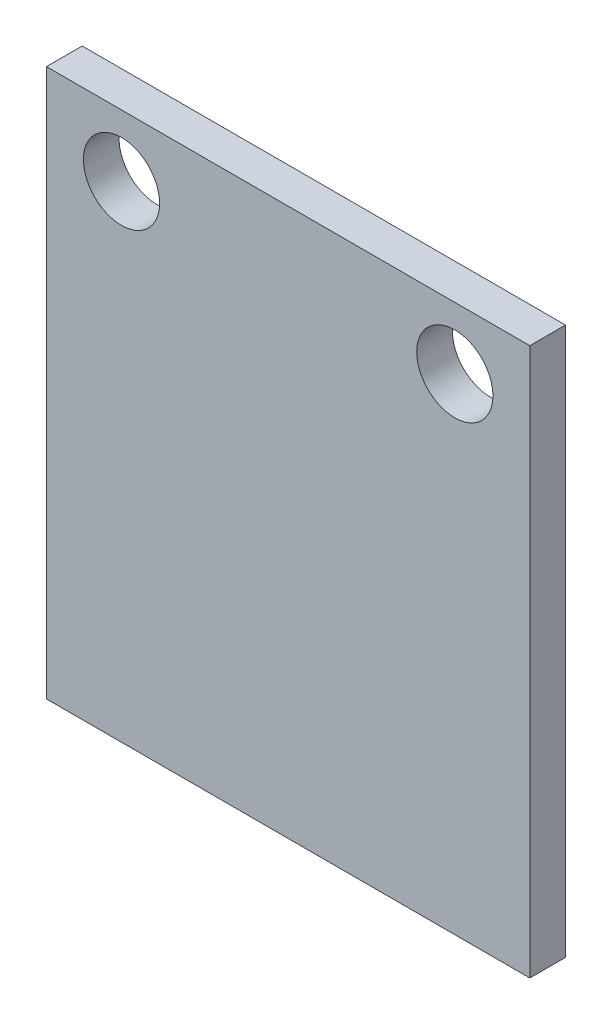
ISO-10303-21;
HEADER;
FILE_DESCRIPTION(('STEP AP214'),'2;1');
FILE_NAME('part.step','',(''),(''),'','','');
FILE_SCHEMA(('AUTOMOTIVE_DESIGN { 1 0 10303 214 1 1 1 1 }'));
ENDSEC;
DATA;
#1=APPLICATION_CONTEXT('core data for automotive mechanical design processes');
#2=APPLICATION_PROTOCOL_DEFINITION('international standard','automotive_design',2000,#1);
#3=PRODUCT_CONTEXT('',#1,'mechanical');
#4=PRODUCT('Part','Part','',(#3));
#5=PRODUCT_RELATED_PRODUCT_CATEGORY('part','',(#4));
#6=PRODUCT_DEFINITION_FORMATION('','',#4);
#7=PRODUCT_DEFINITION_CONTEXT('part definition',#1,'design');
#8=PRODUCT_DEFINITION('design','',#6,#7);
#9=PRODUCT_DEFINITION_SHAPE('','',#8);
#10=(LENGTH_UNIT() NAMED_UNIT(*) SI_UNIT(.MILLI.,.METRE.));
#11=(NAMED_UNIT(*) PLANE_ANGLE_UNIT() SI_UNIT($,.RADIAN.));
#12=(NAMED_UNIT(*) SI_UNIT($,.STERADIAN.) SOLID_ANGLE_UNIT());
#13=UNCERTAINTY_MEASURE_WITH_UNIT(LENGTH_MEASURE(1.E-05),#10,'distance_accuracy_value','');
#14=(GEOMETRIC_REPRESENTATION_CONTEXT(3) GLOBAL_UNCERTAINTY_ASSIGNED_CONTEXT((#13)) GLOBAL_UNIT_ASSIGNED_CONTEXT((#10,
#11,#12)) REPRESENTATION_CONTEXT('',''));
#15=CARTESIAN_POINT('',(0.,0.,0.));
#16=DIRECTION('',(0.,0.,1.));
#17=DIRECTION('',(1.,0.,0.));
#18=AXIS2_PLACEMENT_3D('',#15,#16,#17);
#19=CARTESIAN_POINT('',(0.,0.,1.5));
#20=DIRECTION('',(0.,0.,-1.));
#21=DIRECTION('',(-1.,0.,0.));
#22=AXIS2_PLACEMENT_3D('',#19,#20,#21);
#23=PLANE('',#22);
#24=DIRECTION('',(0.,1.,0.));
#25=VECTOR('',#24,1.);
#26=CARTESIAN_POINT('',(10.15,-11.5,1.5));
#27=LINE('',#26,#25);
#28=CARTESIAN_POINT('',(10.15,-11.5,1.5));
#29=VERTEX_POINT('',#28);
#30=CARTESIAN_POINT('',(10.15,11.5,1.5));
#31=VERTEX_POINT('',#30);
#32=EDGE_CURVE('E87',#29,#31,#27,.T.);
#33=ORIENTED_EDGE('',*,*,#32,.T.);
#34=DIRECTION('',(-1.,0.,0.));
#35=VECTOR('',#34,1.);
#36=CARTESIAN_POINT('',(-10.15,11.5,1.5));
#37=LINE('',#36,#35);
#38=CARTESIAN_POINT('',(-10.15,11.5,1.5));
#39=VERTEX_POINT('',#38);
#40=EDGE_CURVE('E82',#31,#39,#37,.T.);
#41=ORIENTED_EDGE('',*,*,#40,.T.);
#42=DIRECTION('',(0.,-1.,0.));
#43=VECTOR('',#42,1.);
#44=CARTESIAN_POINT('',(-10.15,-11.5,1.5));
#45=LINE('',#44,#43);
#46=CARTESIAN_POINT('',(-10.15,-11.5,1.5));
#47=VERTEX_POINT('',#46);
#48=EDGE_CURVE('E85',#39,#47,#45,.T.);
#49=ORIENTED_EDGE('',*,*,#48,.T.);
#50=DIRECTION('',(1.,0.,0.));
#51=VECTOR('',#50,1.);
#52=CARTESIAN_POINT('',(-10.15,-11.5,1.5));
#53=LINE('',#52,#51);
#54=EDGE_CURVE('E52',#47,#29,#53,.T.);
#55=ORIENTED_EDGE('',*,*,#54,.T.);
#56=EDGE_LOOP('',(#33,#41,#49,#55));
#57=FACE_BOUND('',#56,.T.);
#58=CARTESIAN_POINT('',(-7.,8.9,1.5));
#59=DIRECTION('',(0.,0.,1.));
#60=DIRECTION('',(1.,0.,0.));
#61=AXIS2_PLACEMENT_3D('',#58,#59,#60);
#62=CIRCLE('',#61,1.6);
#63=CARTESIAN_POINT('',(-5.4,8.9,1.5));
#64=VERTEX_POINT('',#63);
#65=EDGE_CURVE('E102',#64,#64,#62,.T.);
#66=ORIENTED_EDGE('',*,*,#65,.F.);
#67=EDGE_LOOP('',(#66));
#68=FACE_BOUND('',#67,.T.);
#69=CARTESIAN_POINT('',(7.,8.9,1.5));
#70=DIRECTION('',(0.,0.,1.));
#71=DIRECTION('',(-1.,0.,0.));
#72=AXIS2_PLACEMENT_3D('',#69,#70,#71);
#73=CIRCLE('',#72,1.6);
#74=CARTESIAN_POINT('',(5.4,8.9,1.5));
#75=VERTEX_POINT('',#74);
#76=EDGE_CURVE('E117',#75,#75,#73,.T.);
#77=ORIENTED_EDGE('',*,*,#76,.F.);
#78=EDGE_LOOP('',(#77));
#79=FACE_BOUND('',#78,.T.);
#80=ADVANCED_FACE('F35',(#57,#68,#79),#23,.F.);
#81=CARTESIAN_POINT('',(0.,0.,0.));
#82=DIRECTION('',(0.,0.,-1.));
#83=DIRECTION('',(-1.,0.,0.));
#84=AXIS2_PLACEMENT_3D('',#81,#82,#83);
#85=PLANE('',#84);
#86=CARTESIAN_POINT('',(-7.,8.9,0.));
#87=DIRECTION('',(0.,0.,1.));
#88=DIRECTION('',(1.,0.,0.));
#89=AXIS2_PLACEMENT_3D('',#86,#87,#88);
#90=CIRCLE('',#89,1.6);
#91=CARTESIAN_POINT('',(-5.4,8.9,0.));
#92=VERTEX_POINT('',#91);
#93=EDGE_CURVE('E114',#92,#92,#90,.T.);
#94=ORIENTED_EDGE('',*,*,#93,.T.);
#95=EDGE_LOOP('',(#94));
#96=FACE_BOUND('',#95,.T.);
#97=DIRECTION('',(0.,1.,0.));
#98=VECTOR('',#97,1.);
#99=CARTESIAN_POINT('',(10.15,-11.5,0.));
#100=LINE('',#99,#98);
#101=CARTESIAN_POINT('',(10.15,-11.5,0.));
#102=VERTEX_POINT('',#101);
#103=CARTESIAN_POINT('',(10.15,11.5,0.));
#104=VERTEX_POINT('',#103);
#105=EDGE_CURVE('E99',#102,#104,#100,.T.);
#106=ORIENTED_EDGE('',*,*,#105,.F.);
#107=DIRECTION('',(1.,0.,0.));
#108=VECTOR('',#107,1.);
#109=CARTESIAN_POINT('',(-10.15,-11.5,0.));
#110=LINE('',#109,#108);
#111=CARTESIAN_POINT('',(-10.15,-11.5,0.));
#112=VERTEX_POINT('',#111);
#113=EDGE_CURVE('E75',#112,#102,#110,.T.);
#114=ORIENTED_EDGE('',*,*,#113,.F.);
#115=DIRECTION('',(0.,-1.,0.));
#116=VECTOR('',#115,1.);
#117=CARTESIAN_POINT('',(-10.15,-11.5,0.));
#118=LINE('',#117,#116);
#119=CARTESIAN_POINT('',(-10.15,11.5,0.));
#120=VERTEX_POINT('',#119);
#121=EDGE_CURVE('E69',#120,#112,#118,.T.);
#122=ORIENTED_EDGE('',*,*,#121,.F.);
#123=DIRECTION('',(-1.,0.,0.));
#124=VECTOR('',#123,1.);
#125=CARTESIAN_POINT('',(-10.15,11.5,0.));
#126=LINE('',#125,#124);
#127=EDGE_CURVE('E91',#104,#120,#126,.T.);
#128=ORIENTED_EDGE('',*,*,#127,.F.);
#129=EDGE_LOOP('',(#106,#114,#122,#128));
#130=FACE_BOUND('',#129,.T.);
#131=CARTESIAN_POINT('',(7.,8.9,0.));
#132=DIRECTION('',(0.,0.,1.));
#133=DIRECTION('',(-1.,0.,0.));
#134=AXIS2_PLACEMENT_3D('',#131,#132,#133);
#135=CIRCLE('',#134,1.6);
#136=CARTESIAN_POINT('',(5.4,8.9,0.));
#137=VERTEX_POINT('',#136);
#138=EDGE_CURVE('E120',#137,#137,#135,.T.);
#139=ORIENTED_EDGE('',*,*,#138,.T.);
#140=EDGE_LOOP('',(#139));
#141=FACE_BOUND('',#140,.T.);
#142=ADVANCED_FACE('F110',(#96,#130,#141),#85,.T.);
#143=CARTESIAN_POINT('',(10.15,-11.5,1.5));
#144=DIRECTION('',(-1.,0.,0.));
#145=DIRECTION('',(0.,0.,1.));
#146=AXIS2_PLACEMENT_3D('',#143,#144,#145);
#147=PLANE('',#146);
#148=ORIENTED_EDGE('',*,*,#105,.T.);
#149=DIRECTION('',(0.,0.,-1.));
#150=VECTOR('',#149,1.);
#151=CARTESIAN_POINT('',(10.15,11.5,1.5));
#152=LINE('',#151,#150);
#153=EDGE_CURVE('E11',#31,#104,#152,.T.);
#154=ORIENTED_EDGE('',*,*,#153,.F.);
#155=ORIENTED_EDGE('',*,*,#32,.F.);
#156=DIRECTION('',(0.,0.,-1.));
#157=VECTOR('',#156,1.);
#158=CARTESIAN_POINT('',(10.15,-11.5,1.5));
#159=LINE('',#158,#157);
#160=EDGE_CURVE('E95',#29,#102,#159,.T.);
#161=ORIENTED_EDGE('',*,*,#160,.T.);
#162=EDGE_LOOP('',(#148,#154,#155,#161));
#163=FACE_BOUND('',#162,.T.);
#164=ADVANCED_FACE('F37',(#163),#147,.F.);
#165=CARTESIAN_POINT('',(-10.15,11.5,1.5));
#166=DIRECTION('',(0.,-1.,0.));
#167=DIRECTION('',(0.,0.,-1.));
#168=AXIS2_PLACEMENT_3D('',#165,#166,#167);
#169=PLANE('',#168);
#170=ORIENTED_EDGE('',*,*,#127,.T.);
#171=DIRECTION('',(0.,0.,-1.));
#172=VECTOR('',#171,1.);
#173=CARTESIAN_POINT('',(-10.15,11.5,1.5));
#174=LINE('',#173,#172);
#175=EDGE_CURVE('E44',#39,#120,#174,.T.);
#176=ORIENTED_EDGE('',*,*,#175,.F.);
#177=ORIENTED_EDGE('',*,*,#40,.F.);
#178=ORIENTED_EDGE('',*,*,#153,.T.);
#179=EDGE_LOOP('',(#170,#176,#177,#178));
#180=FACE_BOUND('',#179,.T.);
#181=ADVANCED_FACE('F90',(#180),#169,.F.);
#182=CARTESIAN_POINT('',(-10.15,-11.5,1.5));
#183=DIRECTION('',(1.,0.,0.));
#184=DIRECTION('',(0.,0.,-1.));
#185=AXIS2_PLACEMENT_3D('',#182,#183,#184);
#186=PLANE('',#185);
#187=ORIENTED_EDGE('',*,*,#121,.T.);
#188=DIRECTION('',(0.,0.,-1.));
#189=VECTOR('',#188,1.);
#190=CARTESIAN_POINT('',(-10.15,-11.5,1.5));
#191=LINE('',#190,#189);
#192=EDGE_CURVE('E92',#47,#112,#191,.T.);
#193=ORIENTED_EDGE('',*,*,#192,.F.);
#194=ORIENTED_EDGE('',*,*,#48,.F.);
#195=ORIENTED_EDGE('',*,*,#175,.T.);
#196=EDGE_LOOP('',(#187,#193,#194,#195));
#197=FACE_BOUND('',#196,.T.);
#198=ADVANCED_FACE('F93',(#197),#186,.F.);
#199=CARTESIAN_POINT('',(-10.15,-11.5,1.5));
#200=DIRECTION('',(0.,1.,0.));
#201=DIRECTION('',(0.,0.,1.));
#202=AXIS2_PLACEMENT_3D('',#199,#200,#201);
#203=PLANE('',#202);
#204=ORIENTED_EDGE('',*,*,#113,.T.);
#205=ORIENTED_EDGE('',*,*,#160,.F.);
#206=ORIENTED_EDGE('',*,*,#54,.F.);
#207=ORIENTED_EDGE('',*,*,#192,.T.);
#208=EDGE_LOOP('',(#204,#205,#206,#207));
#209=FACE_BOUND('',#208,.T.);
#210=ADVANCED_FACE('F107',(#209),#203,.F.);
#211=CARTESIAN_POINT('',(-7.,8.9,1.5));
#212=DIRECTION('',(0.,0.,-1.));
#213=DIRECTION('',(-1.,0.,0.));
#214=AXIS2_PLACEMENT_3D('',#211,#212,#213);
#215=CYLINDRICAL_SURFACE('',#214,1.6);
#216=ORIENTED_EDGE('',*,*,#65,.T.);
#217=EDGE_LOOP('',(#216));
#218=FACE_BOUND('',#217,.T.);
#219=ORIENTED_EDGE('',*,*,#93,.F.);
#220=EDGE_LOOP('',(#219));
#221=FACE_BOUND('',#220,.T.);
#222=ADVANCED_FACE('F137',(#218,#221),#215,.F.);
#223=CARTESIAN_POINT('',(7.,8.9,1.5));
#224=DIRECTION('',(0.,0.,-1.));
#225=DIRECTION('',(-1.,0.,0.));
#226=AXIS2_PLACEMENT_3D('',#223,#224,#225);
#227=CYLINDRICAL_SURFACE('',#226,1.6);
#228=ORIENTED_EDGE('',*,*,#76,.T.);
#229=EDGE_LOOP('',(#228));
#230=FACE_BOUND('',#229,.T.);
#231=ORIENTED_EDGE('',*,*,#138,.F.);
#232=EDGE_LOOP('',(#231));
#233=FACE_BOUND('',#232,.T.);
#234=ADVANCED_FACE('F126',(#230,#233),#227,.F.);
#235=CLOSED_SHELL('',(#80,#142,#164,#181,#198,#210,#222,#234));
#236=MANIFOLD_SOLID_BREP('B2',#235);
#237=ADVANCED_BREP_SHAPE_REPRESENTATION('',(#18,#236),#14);
#238=SHAPE_DEFINITION_REPRESENTATION(#9,#237);
ENDSEC;
END-ISO-10303-21;
